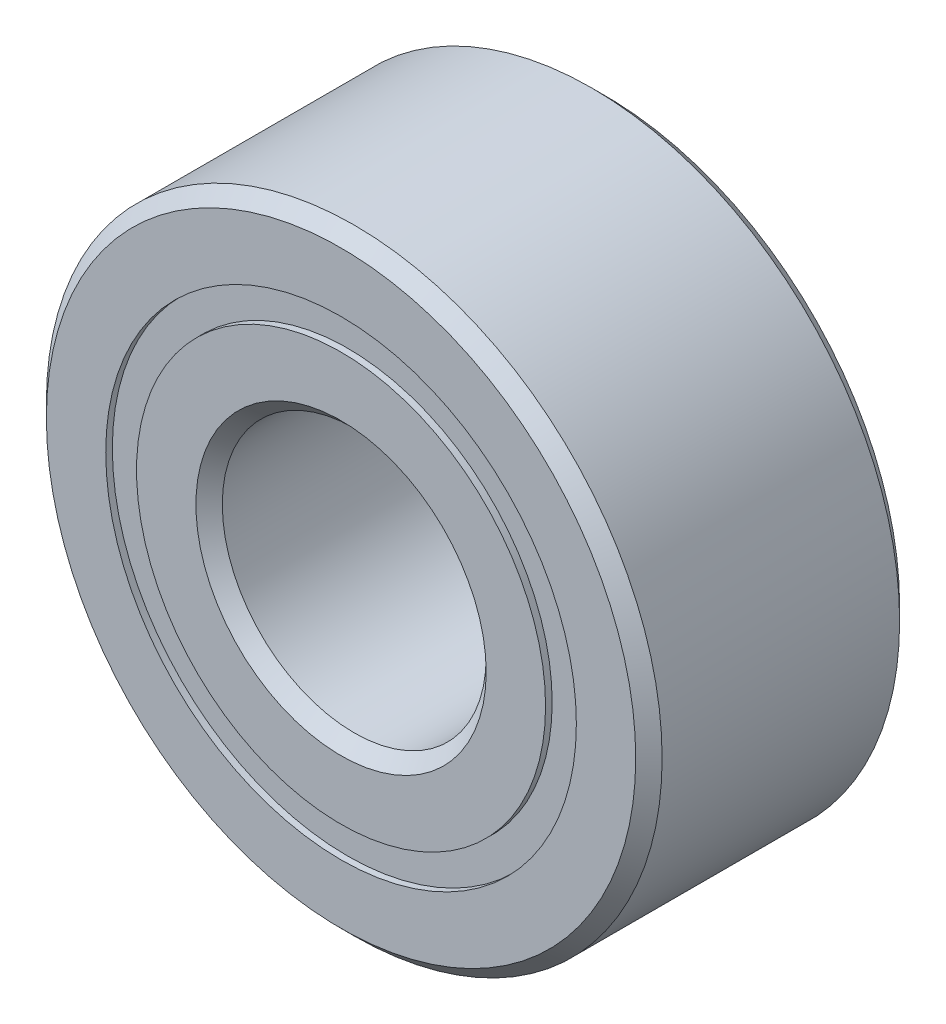
ISO-10303-21;
HEADER;
FILE_DESCRIPTION(('STEP AP214'),'2;1');
FILE_NAME('part.step','',(''),(''),'','','');
FILE_SCHEMA(('AUTOMOTIVE_DESIGN { 1 0 10303 214 1 1 1 1 }'));
ENDSEC;
DATA;
#1=APPLICATION_CONTEXT('core data for automotive mechanical design processes');
#2=APPLICATION_PROTOCOL_DEFINITION('international standard','automotive_design',2000,#1);
#3=PRODUCT_CONTEXT('',#1,'mechanical');
#4=PRODUCT('Part','Part','',(#3));
#5=PRODUCT_RELATED_PRODUCT_CATEGORY('part','',(#4));
#6=PRODUCT_DEFINITION_FORMATION('','',#4);
#7=PRODUCT_DEFINITION_CONTEXT('part definition',#1,'design');
#8=PRODUCT_DEFINITION('design','',#6,#7);
#9=PRODUCT_DEFINITION_SHAPE('','',#8);
#10=(LENGTH_UNIT() NAMED_UNIT(*) SI_UNIT(.MILLI.,.METRE.));
#11=(NAMED_UNIT(*) PLANE_ANGLE_UNIT() SI_UNIT($,.RADIAN.));
#12=(NAMED_UNIT(*) SI_UNIT($,.STERADIAN.) SOLID_ANGLE_UNIT());
#13=UNCERTAINTY_MEASURE_WITH_UNIT(LENGTH_MEASURE(1.E-05),#10,'distance_accuracy_value','');
#14=(GEOMETRIC_REPRESENTATION_CONTEXT(3) GLOBAL_UNCERTAINTY_ASSIGNED_CONTEXT((#13)) GLOBAL_UNIT_ASSIGNED_CONTEXT((#10,
#11,#12)) REPRESENTATION_CONTEXT('',''));
#15=CARTESIAN_POINT('',(0.,0.,0.));
#16=DIRECTION('',(0.,0.,1.));
#17=DIRECTION('',(1.,0.,0.));
#18=AXIS2_PLACEMENT_3D('',#15,#16,#17);
#19=CARTESIAN_POINT('',(1.5,0.,-1.5));
#20=DIRECTION('',(0.,0.,-1.));
#21=DIRECTION('',(-1.,0.,0.));
#22=AXIS2_PLACEMENT_3D('',#19,#20,#21);
#23=PLANE('',#22);
#24=CARTESIAN_POINT('',(0.,0.,-1.5));
#25=DIRECTION('',(0.,0.,-1.));
#26=DIRECTION('',(-1.,0.,0.));
#27=AXIS2_PLACEMENT_3D('',#24,#25,#26);
#28=CIRCLE('',#27,1.65);
#29=CARTESIAN_POINT('',(-1.65,0.,-1.5));
#30=VERTEX_POINT('',#29);
#31=EDGE_CURVE('E68',#30,#30,#28,.F.);
#32=ORIENTED_EDGE('',*,*,#31,.T.);
#33=EDGE_LOOP('',(#32));
#34=FACE_BOUND('',#33,.T.);
#35=CARTESIAN_POINT('',(0.,0.,-1.5));
#36=DIRECTION('',(0.,0.,1.));
#37=DIRECTION('',(1.,0.,0.));
#38=AXIS2_PLACEMENT_3D('',#35,#36,#37);
#39=CIRCLE('',#38,2.325);
#40=CARTESIAN_POINT('',(2.325,0.,-1.5));
#41=VERTEX_POINT('',#40);
#42=EDGE_CURVE('E71',#41,#41,#39,.T.);
#43=ORIENTED_EDGE('',*,*,#42,.F.);
#44=EDGE_LOOP('',(#43));
#45=FACE_BOUND('',#44,.T.);
#46=ADVANCED_FACE('F38',(#34,#45),#23,.T.);
#47=CARTESIAN_POINT('',(0.,0.,0.));
#48=DIRECTION('',(0.,0.,1.));
#49=DIRECTION('',(1.,0.,0.));
#50=AXIS2_PLACEMENT_3D('',#47,#48,#49);
#51=CYLINDRICAL_SURFACE('',#50,2.325);
#52=ORIENTED_EDGE('',*,*,#42,.T.);
#53=EDGE_LOOP('',(#52));
#54=FACE_BOUND('',#53,.T.);
#55=CARTESIAN_POINT('',(0.,0.,-1.425));
#56=DIRECTION('',(0.,0.,1.));
#57=DIRECTION('',(1.,0.,0.));
#58=AXIS2_PLACEMENT_3D('',#55,#56,#57);
#59=CIRCLE('',#58,2.325);
#60=CARTESIAN_POINT('',(2.325,0.,-1.425));
#61=VERTEX_POINT('',#60);
#62=EDGE_CURVE('E74',#61,#61,#59,.T.);
#63=ORIENTED_EDGE('',*,*,#62,.F.);
#64=EDGE_LOOP('',(#63));
#65=FACE_BOUND('',#64,.T.);
#66=ADVANCED_FACE('F114',(#54,#65),#51,.T.);
#67=CARTESIAN_POINT('',(2.325,0.,-1.425));
#68=DIRECTION('',(0.,0.,-1.));
#69=DIRECTION('',(-1.,0.,0.));
#70=AXIS2_PLACEMENT_3D('',#67,#68,#69);
#71=PLANE('',#70);
#72=ORIENTED_EDGE('',*,*,#62,.T.);
#73=EDGE_LOOP('',(#72));
#74=FACE_BOUND('',#73,.T.);
#75=CARTESIAN_POINT('',(0.,0.,-1.425));
#76=DIRECTION('',(0.,0.,1.));
#77=DIRECTION('',(1.,0.,0.));
#78=AXIS2_PLACEMENT_3D('',#75,#76,#77);
#79=CIRCLE('',#78,2.675);
#80=CARTESIAN_POINT('',(2.675,0.,-1.425));
#81=VERTEX_POINT('',#80);
#82=EDGE_CURVE('E77',#81,#81,#79,.T.);
#83=ORIENTED_EDGE('',*,*,#82,.F.);
#84=EDGE_LOOP('',(#83));
#85=FACE_BOUND('',#84,.T.);
#86=ADVANCED_FACE('F120',(#74,#85),#71,.T.);
#87=CARTESIAN_POINT('',(0.,0.,0.));
#88=DIRECTION('',(0.,0.,1.));
#89=DIRECTION('',(1.,0.,0.));
#90=AXIS2_PLACEMENT_3D('',#87,#88,#89);
#91=CYLINDRICAL_SURFACE('',#90,2.675);
#92=ORIENTED_EDGE('',*,*,#82,.T.);
#93=EDGE_LOOP('',(#92));
#94=FACE_BOUND('',#93,.T.);
#95=CARTESIAN_POINT('',(0.,0.,-1.5));
#96=DIRECTION('',(0.,0.,1.));
#97=DIRECTION('',(1.,0.,0.));
#98=AXIS2_PLACEMENT_3D('',#95,#96,#97);
#99=CIRCLE('',#98,2.675);
#100=CARTESIAN_POINT('',(2.675,0.,-1.5));
#101=VERTEX_POINT('',#100);
#102=EDGE_CURVE('E80',#101,#101,#99,.T.);
#103=ORIENTED_EDGE('',*,*,#102,.F.);
#104=EDGE_LOOP('',(#103));
#105=FACE_BOUND('',#104,.T.);
#106=ADVANCED_FACE('F173',(#94,#105),#91,.F.);
#107=CARTESIAN_POINT('',(2.675,0.,-1.5));
#108=DIRECTION('',(0.,0.,-1.));
#109=DIRECTION('',(-1.,0.,0.));
#110=AXIS2_PLACEMENT_3D('',#107,#108,#109);
#111=PLANE('',#110);
#112=CARTESIAN_POINT('',(0.,0.,-1.5));
#113=DIRECTION('',(0.,0.,-1.));
#114=DIRECTION('',(-1.,0.,0.));
#115=AXIS2_PLACEMENT_3D('',#112,#113,#114);
#116=CIRCLE('',#115,3.35);
#117=CARTESIAN_POINT('',(-3.35,0.,-1.5));
#118=VERTEX_POINT('',#117);
#119=EDGE_CURVE('E10',#118,#118,#116,.T.);
#120=ORIENTED_EDGE('',*,*,#119,.T.);
#121=EDGE_LOOP('',(#120));
#122=FACE_BOUND('',#121,.T.);
#123=ORIENTED_EDGE('',*,*,#102,.T.);
#124=EDGE_LOOP('',(#123));
#125=FACE_BOUND('',#124,.T.);
#126=ADVANCED_FACE('F170',(#122,#125),#111,.T.);
#127=CARTESIAN_POINT('',(0.,0.,0.));
#128=DIRECTION('',(0.,0.,1.));
#129=DIRECTION('',(1.,0.,0.));
#130=AXIS2_PLACEMENT_3D('',#127,#128,#129);
#131=CYLINDRICAL_SURFACE('',#130,3.5);
#132=CARTESIAN_POINT('',(0.,0.,1.35));
#133=DIRECTION('',(0.,0.,1.));
#134=DIRECTION('',(1.,0.,0.));
#135=AXIS2_PLACEMENT_3D('',#132,#133,#134);
#136=CIRCLE('',#135,3.5);
#137=CARTESIAN_POINT('',(3.5,0.,1.35));
#138=VERTEX_POINT('',#137);
#139=EDGE_CURVE('E46',#138,#138,#136,.F.);
#140=ORIENTED_EDGE('',*,*,#139,.T.);
#141=EDGE_LOOP('',(#140));
#142=FACE_BOUND('',#141,.T.);
#143=CARTESIAN_POINT('',(0.,0.,-1.35));
#144=DIRECTION('',(0.,0.,-1.));
#145=DIRECTION('',(-1.,0.,0.));
#146=AXIS2_PLACEMENT_3D('',#143,#144,#145);
#147=CIRCLE('',#146,3.5);
#148=CARTESIAN_POINT('',(-3.5,0.,-1.35));
#149=VERTEX_POINT('',#148);
#150=EDGE_CURVE('E50',#149,#149,#147,.F.);
#151=ORIENTED_EDGE('',*,*,#150,.T.);
#152=EDGE_LOOP('',(#151));
#153=FACE_BOUND('',#152,.T.);
#154=ADVANCED_FACE('F155',(#142,#153),#131,.T.);
#155=CARTESIAN_POINT('',(2.675,0.,1.5));
#156=DIRECTION('',(0.,0.,1.));
#157=DIRECTION('',(1.,0.,0.));
#158=AXIS2_PLACEMENT_3D('',#155,#156,#157);
#159=PLANE('',#158);
#160=CARTESIAN_POINT('',(0.,0.,1.5));
#161=DIRECTION('',(0.,0.,1.));
#162=DIRECTION('',(1.,0.,0.));
#163=AXIS2_PLACEMENT_3D('',#160,#161,#162);
#164=CIRCLE('',#163,3.35);
#165=CARTESIAN_POINT('',(3.35,0.,1.5));
#166=VERTEX_POINT('',#165);
#167=EDGE_CURVE('E54',#166,#166,#164,.T.);
#168=ORIENTED_EDGE('',*,*,#167,.T.);
#169=EDGE_LOOP('',(#168));
#170=FACE_BOUND('',#169,.T.);
#171=CARTESIAN_POINT('',(0.,0.,1.5));
#172=DIRECTION('',(0.,0.,1.));
#173=DIRECTION('',(1.,0.,0.));
#174=AXIS2_PLACEMENT_3D('',#171,#172,#173);
#175=CIRCLE('',#174,2.675);
#176=CARTESIAN_POINT('',(2.675,0.,1.5));
#177=VERTEX_POINT('',#176);
#178=EDGE_CURVE('E83',#177,#177,#175,.T.);
#179=ORIENTED_EDGE('',*,*,#178,.F.);
#180=EDGE_LOOP('',(#179));
#181=FACE_BOUND('',#180,.T.);
#182=ADVANCED_FACE('F152',(#170,#181),#159,.T.);
#183=CARTESIAN_POINT('',(0.,0.,0.));
#184=DIRECTION('',(0.,0.,1.));
#185=DIRECTION('',(1.,0.,0.));
#186=AXIS2_PLACEMENT_3D('',#183,#184,#185);
#187=CYLINDRICAL_SURFACE('',#186,2.675);
#188=ORIENTED_EDGE('',*,*,#178,.T.);
#189=EDGE_LOOP('',(#188));
#190=FACE_BOUND('',#189,.T.);
#191=CARTESIAN_POINT('',(0.,0.,1.425));
#192=DIRECTION('',(0.,0.,1.));
#193=DIRECTION('',(1.,0.,0.));
#194=AXIS2_PLACEMENT_3D('',#191,#192,#193);
#195=CIRCLE('',#194,2.675);
#196=CARTESIAN_POINT('',(2.675,0.,1.425));
#197=VERTEX_POINT('',#196);
#198=EDGE_CURVE('E86',#197,#197,#195,.T.);
#199=ORIENTED_EDGE('',*,*,#198,.F.);
#200=EDGE_LOOP('',(#199));
#201=FACE_BOUND('',#200,.T.);
#202=ADVANCED_FACE('F110',(#190,#201),#187,.F.);
#203=CARTESIAN_POINT('',(2.325,0.,1.425));
#204=DIRECTION('',(0.,0.,1.));
#205=DIRECTION('',(1.,0.,0.));
#206=AXIS2_PLACEMENT_3D('',#203,#204,#205);
#207=PLANE('',#206);
#208=ORIENTED_EDGE('',*,*,#198,.T.);
#209=EDGE_LOOP('',(#208));
#210=FACE_BOUND('',#209,.T.);
#211=CARTESIAN_POINT('',(0.,0.,1.425));
#212=DIRECTION('',(0.,0.,1.));
#213=DIRECTION('',(1.,0.,0.));
#214=AXIS2_PLACEMENT_3D('',#211,#212,#213);
#215=CIRCLE('',#214,2.325);
#216=CARTESIAN_POINT('',(2.325,0.,1.425));
#217=VERTEX_POINT('',#216);
#218=EDGE_CURVE('E89',#217,#217,#215,.T.);
#219=ORIENTED_EDGE('',*,*,#218,.F.);
#220=EDGE_LOOP('',(#219));
#221=FACE_BOUND('',#220,.T.);
#222=ADVANCED_FACE('F100',(#210,#221),#207,.T.);
#223=CARTESIAN_POINT('',(0.,0.,0.));
#224=DIRECTION('',(0.,0.,1.));
#225=DIRECTION('',(1.,0.,0.));
#226=AXIS2_PLACEMENT_3D('',#223,#224,#225);
#227=CYLINDRICAL_SURFACE('',#226,2.325);
#228=ORIENTED_EDGE('',*,*,#218,.T.);
#229=EDGE_LOOP('',(#228));
#230=FACE_BOUND('',#229,.T.);
#231=CARTESIAN_POINT('',(0.,0.,1.5));
#232=DIRECTION('',(0.,0.,1.));
#233=DIRECTION('',(1.,0.,0.));
#234=AXIS2_PLACEMENT_3D('',#231,#232,#233);
#235=CIRCLE('',#234,2.325);
#236=CARTESIAN_POINT('',(2.325,0.,1.5));
#237=VERTEX_POINT('',#236);
#238=EDGE_CURVE('E92',#237,#237,#235,.T.);
#239=ORIENTED_EDGE('',*,*,#238,.F.);
#240=EDGE_LOOP('',(#239));
#241=FACE_BOUND('',#240,.T.);
#242=ADVANCED_FACE('F98',(#230,#241),#227,.T.);
#243=CARTESIAN_POINT('',(1.5,0.,1.5));
#244=DIRECTION('',(0.,0.,1.));
#245=DIRECTION('',(1.,0.,0.));
#246=AXIS2_PLACEMENT_3D('',#243,#244,#245);
#247=PLANE('',#246);
#248=CARTESIAN_POINT('',(0.,0.,1.5));
#249=DIRECTION('',(0.,0.,1.));
#250=DIRECTION('',(1.,0.,0.));
#251=AXIS2_PLACEMENT_3D('',#248,#249,#250);
#252=CIRCLE('',#251,1.65);
#253=CARTESIAN_POINT('',(1.65,0.,1.5));
#254=VERTEX_POINT('',#253);
#255=EDGE_CURVE('E59',#254,#254,#252,.F.);
#256=ORIENTED_EDGE('',*,*,#255,.T.);
#257=EDGE_LOOP('',(#256));
#258=FACE_BOUND('',#257,.T.);
#259=ORIENTED_EDGE('',*,*,#238,.T.);
#260=EDGE_LOOP('',(#259));
#261=FACE_BOUND('',#260,.T.);
#262=ADVANCED_FACE('F96',(#258,#261),#247,.T.);
#263=CARTESIAN_POINT('',(0.,0.,0.));
#264=DIRECTION('',(0.,0.,1.));
#265=DIRECTION('',(1.,0.,0.));
#266=AXIS2_PLACEMENT_3D('',#263,#264,#265);
#267=CYLINDRICAL_SURFACE('',#266,1.5);
#268=CARTESIAN_POINT('',(0.,0.,-1.35));
#269=DIRECTION('',(0.,0.,-1.));
#270=DIRECTION('',(-1.,0.,0.));
#271=AXIS2_PLACEMENT_3D('',#268,#269,#270);
#272=CIRCLE('',#271,1.5);
#273=CARTESIAN_POINT('',(-1.5,0.,-1.35));
#274=VERTEX_POINT('',#273);
#275=EDGE_CURVE('E62',#274,#274,#272,.T.);
#276=ORIENTED_EDGE('',*,*,#275,.T.);
#277=EDGE_LOOP('',(#276));
#278=FACE_BOUND('',#277,.T.);
#279=CARTESIAN_POINT('',(0.,0.,1.35));
#280=DIRECTION('',(0.,0.,1.));
#281=DIRECTION('',(1.,0.,0.));
#282=AXIS2_PLACEMENT_3D('',#279,#280,#281);
#283=CIRCLE('',#282,1.5);
#284=CARTESIAN_POINT('',(1.5,0.,1.35));
#285=VERTEX_POINT('',#284);
#286=EDGE_CURVE('E65',#285,#285,#283,.T.);
#287=ORIENTED_EDGE('',*,*,#286,.T.);
#288=EDGE_LOOP('',(#287));
#289=FACE_BOUND('',#288,.T.);
#290=ADVANCED_FACE('F107',(#278,#289),#267,.F.);
#291=CARTESIAN_POINT('',(0.,0.,-1.5));
#292=DIRECTION('',(0.,0.,-1.));
#293=DIRECTION('',(-1.,0.,0.));
#294=AXIS2_PLACEMENT_3D('',#291,#292,#293);
#295=CONICAL_SURFACE('',#294,1.65,0.785398163397448);
#296=ORIENTED_EDGE('',*,*,#275,.F.);
#297=EDGE_LOOP('',(#296));
#298=FACE_BOUND('',#297,.T.);
#299=ORIENTED_EDGE('',*,*,#31,.F.);
#300=EDGE_LOOP('',(#299));
#301=FACE_BOUND('',#300,.T.);
#302=ADVANCED_FACE('F127',(#298,#301),#295,.F.);
#303=CARTESIAN_POINT('',(0.,0.,1.35));
#304=DIRECTION('',(0.,0.,1.));
#305=DIRECTION('',(1.,0.,0.));
#306=AXIS2_PLACEMENT_3D('',#303,#304,#305);
#307=CONICAL_SURFACE('',#306,1.5,0.785398163397449);
#308=ORIENTED_EDGE('',*,*,#255,.F.);
#309=EDGE_LOOP('',(#308));
#310=FACE_BOUND('',#309,.T.);
#311=ORIENTED_EDGE('',*,*,#286,.F.);
#312=EDGE_LOOP('',(#311));
#313=FACE_BOUND('',#312,.T.);
#314=ADVANCED_FACE('F133',(#310,#313),#307,.F.);
#315=CARTESIAN_POINT('',(0.,0.,1.5));
#316=DIRECTION('',(0.,0.,-1.));
#317=DIRECTION('',(-1.,0.,0.));
#318=AXIS2_PLACEMENT_3D('',#315,#316,#317);
#319=CONICAL_SURFACE('',#318,3.35,0.78539816339745);
#320=ORIENTED_EDGE('',*,*,#139,.F.);
#321=EDGE_LOOP('',(#320));
#322=FACE_BOUND('',#321,.T.);
#323=ORIENTED_EDGE('',*,*,#167,.F.);
#324=EDGE_LOOP('',(#323));
#325=FACE_BOUND('',#324,.T.);
#326=ADVANCED_FACE('F139',(#322,#325),#319,.T.);
#327=CARTESIAN_POINT('',(0.,0.,-1.35));
#328=DIRECTION('',(0.,0.,1.));
#329=DIRECTION('',(1.,0.,0.));
#330=AXIS2_PLACEMENT_3D('',#327,#328,#329);
#331=CONICAL_SURFACE('',#330,3.5,0.78539816339745);
#332=ORIENTED_EDGE('',*,*,#119,.F.);
#333=EDGE_LOOP('',(#332));
#334=FACE_BOUND('',#333,.T.);
#335=ORIENTED_EDGE('',*,*,#150,.F.);
#336=EDGE_LOOP('',(#335));
#337=FACE_BOUND('',#336,.T.);
#338=ADVANCED_FACE('F41',(#334,#337),#331,.T.);
#339=CLOSED_SHELL('',(#46,#66,#86,#106,#126,#154,#182,#202,#222,#242,#262,#290,#302,#314,#326,#338));
#340=MANIFOLD_SOLID_BREP('B2',#339);
#341=ADVANCED_BREP_SHAPE_REPRESENTATION('',(#18,#340),#14);
#342=SHAPE_DEFINITION_REPRESENTATION(#9,#341);
ENDSEC;
END-ISO-10303-21;
